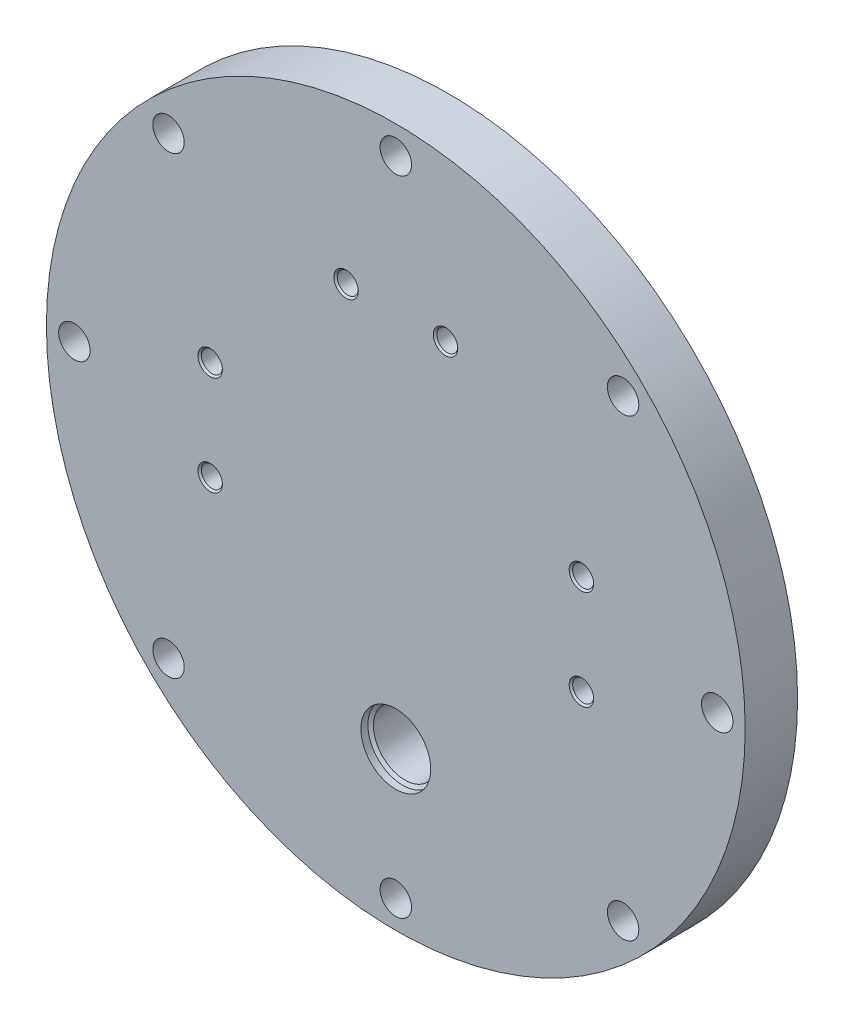
ISO-10303-21;
HEADER;
FILE_DESCRIPTION(('STEP AP214'),'2;1');
FILE_NAME('part.step','',(''),(''),'','','');
FILE_SCHEMA(('AUTOMOTIVE_DESIGN { 1 0 10303 214 1 1 1 1 }'));
ENDSEC;
DATA;
#1=APPLICATION_CONTEXT('core data for automotive mechanical design processes');
#2=APPLICATION_PROTOCOL_DEFINITION('international standard','automotive_design',2000,#1);
#3=PRODUCT_CONTEXT('',#1,'mechanical');
#4=PRODUCT('Part','Part','',(#3));
#5=PRODUCT_RELATED_PRODUCT_CATEGORY('part','',(#4));
#6=PRODUCT_DEFINITION_FORMATION('','',#4);
#7=PRODUCT_DEFINITION_CONTEXT('part definition',#1,'design');
#8=PRODUCT_DEFINITION('design','',#6,#7);
#9=PRODUCT_DEFINITION_SHAPE('','',#8);
#10=(LENGTH_UNIT() NAMED_UNIT(*) SI_UNIT(.MILLI.,.METRE.));
#11=(NAMED_UNIT(*) PLANE_ANGLE_UNIT() SI_UNIT($,.RADIAN.));
#12=(NAMED_UNIT(*) SI_UNIT($,.STERADIAN.) SOLID_ANGLE_UNIT());
#13=UNCERTAINTY_MEASURE_WITH_UNIT(LENGTH_MEASURE(1.E-05),#10,'distance_accuracy_value','');
#14=(GEOMETRIC_REPRESENTATION_CONTEXT(3) GLOBAL_UNCERTAINTY_ASSIGNED_CONTEXT((#13)) GLOBAL_UNIT_ASSIGNED_CONTEXT((#10,
#11,#12)) REPRESENTATION_CONTEXT('',''));
#15=CARTESIAN_POINT('',(0.,0.,0.));
#16=DIRECTION('',(0.,0.,1.));
#17=DIRECTION('',(1.,0.,0.));
#18=AXIS2_PLACEMENT_3D('',#15,#16,#17);
#19=CARTESIAN_POINT('',(38.8908729652601,38.8908729652601,5.00000000010914));
#20=DIRECTION('',(0.,0.,-1.));
#21=DIRECTION('',(-1.,0.,0.));
#22=AXIS2_PLACEMENT_3D('',#19,#20,#21);
#23=CONICAL_SURFACE('',#22,3.32349999981692,1.02974425858134);
#24=CARTESIAN_POINT('',(38.8908729652601,38.8908729650552,6.99696026742913));
#25=VERTEX_POINT('',#24);
#26=VERTEX_LOOP('',#25);
#27=FACE_BOUND('',#26,.T.);
#28=CARTESIAN_POINT('',(38.8908729652601,38.8908729652601,5.));
#29=DIRECTION('',(0.,0.,-1.));
#30=DIRECTION('',(-1.,0.,0.));
#31=AXIS2_PLACEMENT_3D('',#28,#29,#30);
#32=CIRCLE('',#31,3.3235);
#33=CARTESIAN_POINT('',(35.5673729652601,38.8908729652601,5.));
#34=VERTEX_POINT('',#33);
#35=EDGE_CURVE('E43',#34,#34,#32,.T.);
#36=ORIENTED_EDGE('',*,*,#35,.T.);
#37=EDGE_LOOP('',(#36));
#38=FACE_BOUND('',#37,.T.);
#39=ADVANCED_FACE('F16',(#27,#38),#23,.F.);
#40=CARTESIAN_POINT('',(38.8908729652601,-38.8908729652601,5.00000000010914));
#41=DIRECTION('',(0.,0.,-1.));
#42=DIRECTION('',(-1.,0.,0.));
#43=AXIS2_PLACEMENT_3D('',#40,#41,#42);
#44=CONICAL_SURFACE('',#43,3.32349999981692,1.02974425858134);
#45=CARTESIAN_POINT('',(38.8908729650552,-38.8908729652601,6.99696026742913));
#46=VERTEX_POINT('',#45);
#47=VERTEX_LOOP('',#46);
#48=FACE_BOUND('',#47,.T.);
#49=CARTESIAN_POINT('',(38.8908729652601,-38.8908729652601,5.));
#50=DIRECTION('',(0.,0.,-1.));
#51=DIRECTION('',(-1.,0.,0.));
#52=AXIS2_PLACEMENT_3D('',#49,#50,#51);
#53=CIRCLE('',#52,3.3235);
#54=CARTESIAN_POINT('',(35.5673729652601,-38.8908729652601,5.));
#55=VERTEX_POINT('',#54);
#56=EDGE_CURVE('E45',#55,#55,#53,.T.);
#57=ORIENTED_EDGE('',*,*,#56,.T.);
#58=EDGE_LOOP('',(#57));
#59=FACE_BOUND('',#58,.T.);
#60=ADVANCED_FACE('F40',(#48,#59),#44,.F.);
#61=CARTESIAN_POINT('',(-38.8908729652601,-38.8908729652601,5.00000000010914));
#62=DIRECTION('',(0.,0.,-1.));
#63=DIRECTION('',(-1.,0.,0.));
#64=AXIS2_PLACEMENT_3D('',#61,#62,#63);
#65=CONICAL_SURFACE('',#64,3.32349999981692,1.02974425858134);
#66=CARTESIAN_POINT('',(-38.8908729652601,-38.8908729650552,6.99696026742913));
#67=VERTEX_POINT('',#66);
#68=VERTEX_LOOP('',#67);
#69=FACE_BOUND('',#68,.T.);
#70=CARTESIAN_POINT('',(-38.8908729652601,-38.8908729652601,5.));
#71=DIRECTION('',(0.,0.,-1.));
#72=DIRECTION('',(-1.,0.,0.));
#73=AXIS2_PLACEMENT_3D('',#70,#71,#72);
#74=CIRCLE('',#73,3.3235);
#75=CARTESIAN_POINT('',(-42.2143729652601,-38.8908729652601,5.));
#76=VERTEX_POINT('',#75);
#77=EDGE_CURVE('E48',#76,#76,#74,.T.);
#78=ORIENTED_EDGE('',*,*,#77,.T.);
#79=EDGE_LOOP('',(#78));
#80=FACE_BOUND('',#79,.T.);
#81=ADVANCED_FACE('F214',(#69,#80),#65,.F.);
#82=CARTESIAN_POINT('',(-38.8908729652601,38.8908729652601,5.00000000010914));
#83=DIRECTION('',(0.,0.,-1.));
#84=DIRECTION('',(-1.,0.,0.));
#85=AXIS2_PLACEMENT_3D('',#82,#83,#84);
#86=CONICAL_SURFACE('',#85,3.32349999981692,1.02974425858134);
#87=CARTESIAN_POINT('',(-38.8908729650552,38.8908729652601,6.99696026742913));
#88=VERTEX_POINT('',#87);
#89=VERTEX_LOOP('',#88);
#90=FACE_BOUND('',#89,.T.);
#91=CARTESIAN_POINT('',(-38.8908729652601,38.8908729652601,5.));
#92=DIRECTION('',(0.,0.,-1.));
#93=DIRECTION('',(-1.,0.,0.));
#94=AXIS2_PLACEMENT_3D('',#91,#92,#93);
#95=CIRCLE('',#94,3.3235);
#96=CARTESIAN_POINT('',(-42.2143729652601,38.8908729652601,5.));
#97=VERTEX_POINT('',#96);
#98=EDGE_CURVE('E202',#97,#97,#95,.T.);
#99=ORIENTED_EDGE('',*,*,#98,.T.);
#100=EDGE_LOOP('',(#99));
#101=FACE_BOUND('',#100,.T.);
#102=ADVANCED_FACE('F398',(#90,#101),#86,.F.);
#103=CARTESIAN_POINT('',(38.8908729652601,38.8908729652601,-5.));
#104=DIRECTION('',(0.,0.,-1.));
#105=DIRECTION('',(-1.,0.,0.));
#106=AXIS2_PLACEMENT_3D('',#103,#104,#105);
#107=CYLINDRICAL_SURFACE('',#106,3.3235);
#108=ORIENTED_EDGE('',*,*,#35,.F.);
#109=EDGE_LOOP('',(#108));
#110=FACE_BOUND('',#109,.T.);
#111=CARTESIAN_POINT('',(38.8908729652601,38.8908729652601,-13.8235000000009));
#112=DIRECTION('',(0.,0.,-1.));
#113=DIRECTION('',(0.,1.,0.));
#114=AXIS2_PLACEMENT_3D('',#111,#112,#113);
#115=CIRCLE('',#114,3.32350000004429);
#116=CARTESIAN_POINT('',(38.8908729652601,42.2143729653044,-13.8235000000009));
#117=VERTEX_POINT('',#116);
#118=EDGE_CURVE('E197',#117,#117,#115,.T.);
#119=ORIENTED_EDGE('',*,*,#118,.T.);
#120=EDGE_LOOP('',(#119));
#121=FACE_BOUND('',#120,.T.);
#122=ADVANCED_FACE('F394',(#110,#121),#107,.F.);
#123=CARTESIAN_POINT('',(38.8908729652601,-38.8908729652601,-5.));
#124=DIRECTION('',(0.,0.,-1.));
#125=DIRECTION('',(-1.,0.,0.));
#126=AXIS2_PLACEMENT_3D('',#123,#124,#125);
#127=CYLINDRICAL_SURFACE('',#126,3.3235);
#128=ORIENTED_EDGE('',*,*,#56,.F.);
#129=EDGE_LOOP('',(#128));
#130=FACE_BOUND('',#129,.T.);
#131=CARTESIAN_POINT('',(38.8908729652601,-38.8908729652601,-13.8235000000009));
#132=DIRECTION('',(0.,0.,-1.));
#133=DIRECTION('',(1.,0.,0.));
#134=AXIS2_PLACEMENT_3D('',#131,#132,#133);
#135=CIRCLE('',#134,3.32350000004429);
#136=CARTESIAN_POINT('',(42.2143729653044,-38.8908729652601,-13.8235000000009));
#137=VERTEX_POINT('',#136);
#138=EDGE_CURVE('E192',#137,#137,#135,.T.);
#139=ORIENTED_EDGE('',*,*,#138,.T.);
#140=EDGE_LOOP('',(#139));
#141=FACE_BOUND('',#140,.T.);
#142=ADVANCED_FACE('F220',(#130,#141),#127,.F.);
#143=CARTESIAN_POINT('',(-38.8908729652601,-38.8908729652601,-5.));
#144=DIRECTION('',(0.,0.,-1.));
#145=DIRECTION('',(-1.,0.,0.));
#146=AXIS2_PLACEMENT_3D('',#143,#144,#145);
#147=CYLINDRICAL_SURFACE('',#146,3.3235);
#148=ORIENTED_EDGE('',*,*,#77,.F.);
#149=EDGE_LOOP('',(#148));
#150=FACE_BOUND('',#149,.T.);
#151=CARTESIAN_POINT('',(-38.8908729652601,-38.8908729652601,-13.8235000000009));
#152=DIRECTION('',(0.,0.,-1.));
#153=DIRECTION('',(0.,-1.,0.));
#154=AXIS2_PLACEMENT_3D('',#151,#152,#153);
#155=CIRCLE('',#154,3.32350000004429);
#156=CARTESIAN_POINT('',(-38.8908729652601,-42.2143729653044,-13.8235000000009));
#157=VERTEX_POINT('',#156);
#158=EDGE_CURVE('E187',#157,#157,#155,.T.);
#159=ORIENTED_EDGE('',*,*,#158,.T.);
#160=EDGE_LOOP('',(#159));
#161=FACE_BOUND('',#160,.T.);
#162=ADVANCED_FACE('F216',(#150,#161),#147,.F.);
#163=CARTESIAN_POINT('',(-38.8908729652601,38.8908729652601,-5.));
#164=DIRECTION('',(0.,0.,-1.));
#165=DIRECTION('',(-1.,0.,0.));
#166=AXIS2_PLACEMENT_3D('',#163,#164,#165);
#167=CYLINDRICAL_SURFACE('',#166,3.3235);
#168=ORIENTED_EDGE('',*,*,#98,.F.);
#169=EDGE_LOOP('',(#168));
#170=FACE_BOUND('',#169,.T.);
#171=CARTESIAN_POINT('',(-38.8908729652601,38.8908729652601,-13.8235000000009));
#172=DIRECTION('',(0.,0.,-1.));
#173=DIRECTION('',(-1.,0.,0.));
#174=AXIS2_PLACEMENT_3D('',#171,#172,#173);
#175=CIRCLE('',#174,3.32350000004429);
#176=CARTESIAN_POINT('',(-42.2143729653044,38.8908729652601,-13.8235000000009));
#177=VERTEX_POINT('',#176);
#178=EDGE_CURVE('E175',#177,#177,#175,.T.);
#179=ORIENTED_EDGE('',*,*,#178,.T.);
#180=EDGE_LOOP('',(#179));
#181=FACE_BOUND('',#180,.T.);
#182=ADVANCED_FACE('F219',(#170,#181),#167,.F.);
#183=CARTESIAN_POINT('',(0.,-55.,-5.6843418860808E-11));
#184=DIRECTION('',(0.,0.,1.));
#185=DIRECTION('',(1.,0.,0.));
#186=AXIS2_PLACEMENT_3D('',#183,#184,#185);
#187=CONICAL_SURFACE('',#186,8.99999999984402,1.0297442586752);
#188=CARTESIAN_POINT('',(0.,-55.,0.));
#189=DIRECTION('',(0.,0.,1.));
#190=DIRECTION('',(1.,0.,0.));
#191=AXIS2_PLACEMENT_3D('',#188,#189,#190);
#192=CIRCLE('',#191,9.);
#193=CARTESIAN_POINT('',(9.,-55.,0.));
#194=VERTEX_POINT('',#193);
#195=EDGE_CURVE('E166',#194,#194,#192,.T.);
#196=ORIENTED_EDGE('',*,*,#195,.T.);
#197=EDGE_LOOP('',(#196));
#198=FACE_BOUND('',#197,.T.);
#199=CARTESIAN_POINT('',(0.,-55.,-1.5021515475689));
#200=DIRECTION('',(0.,0.,-1.));
#201=DIRECTION('',(-1.,0.,0.));
#202=AXIS2_PLACEMENT_3D('',#199,#200,#201);
#203=CIRCLE('',#202,6.5);
#204=CARTESIAN_POINT('',(-6.5,-55.,-1.5021515475689));
#205=VERTEX_POINT('',#204);
#206=EDGE_CURVE('E170',#205,#205,#203,.T.);
#207=ORIENTED_EDGE('',*,*,#206,.T.);
#208=EDGE_LOOP('',(#207));
#209=FACE_BOUND('',#208,.T.);
#210=ADVANCED_FACE('F385',(#198,#209),#187,.F.);
#211=CARTESIAN_POINT('',(38.8908729652601,38.8908729652601,-15.0000000000432));
#212=DIRECTION('',(0.,0.,-1.));
#213=DIRECTION('',(-1.,0.,0.));
#214=AXIS2_PLACEMENT_3D('',#211,#212,#213);
#215=CONICAL_SURFACE('',#214,4.50000000008662,0.785398163397448);
#216=ORIENTED_EDGE('',*,*,#118,.F.);
#217=EDGE_LOOP('',(#216));
#218=FACE_BOUND('',#217,.T.);
#219=CARTESIAN_POINT('',(38.8908729652601,38.8908729652601,-14.9999999999864));
#220=DIRECTION('',(0.,0.,-1.));
#221=DIRECTION('',(-1.,0.,0.));
#222=AXIS2_PLACEMENT_3D('',#219,#220,#221);
#223=CIRCLE('',#222,4.50000000002977);
#224=CARTESIAN_POINT('',(34.3908729652303,38.8908729652601,-14.9999999999864));
#225=VERTEX_POINT('',#224);
#226=EDGE_CURVE('E19',#225,#225,#223,.T.);
#227=ORIENTED_EDGE('',*,*,#226,.T.);
#228=EDGE_LOOP('',(#227));
#229=FACE_BOUND('',#228,.T.);
#230=ADVANCED_FACE('F381',(#218,#229),#215,.F.);
#231=CARTESIAN_POINT('',(38.8908729652601,-38.8908729652601,-15.0000000000432));
#232=DIRECTION('',(0.,0.,-1.));
#233=DIRECTION('',(-1.,0.,0.));
#234=AXIS2_PLACEMENT_3D('',#231,#232,#233);
#235=CONICAL_SURFACE('',#234,4.50000000008662,0.785398163397448);
#236=ORIENTED_EDGE('',*,*,#138,.F.);
#237=EDGE_LOOP('',(#236));
#238=FACE_BOUND('',#237,.T.);
#239=CARTESIAN_POINT('',(38.8908729652601,-38.8908729652601,-14.9999999999864));
#240=DIRECTION('',(0.,0.,-1.));
#241=DIRECTION('',(-1.,0.,0.));
#242=AXIS2_PLACEMENT_3D('',#239,#240,#241);
#243=CIRCLE('',#242,4.50000000002977);
#244=CARTESIAN_POINT('',(34.3908729652303,-38.8908729652601,-14.9999999999864));
#245=VERTEX_POINT('',#244);
#246=EDGE_CURVE('E161',#245,#245,#243,.T.);
#247=ORIENTED_EDGE('',*,*,#246,.T.);
#248=EDGE_LOOP('',(#247));
#249=FACE_BOUND('',#248,.T.);
#250=ADVANCED_FACE('F228',(#238,#249),#235,.F.);
#251=CARTESIAN_POINT('',(-38.8908729652601,-38.8908729652601,-15.0000000000432));
#252=DIRECTION('',(0.,0.,-1.));
#253=DIRECTION('',(-1.,0.,0.));
#254=AXIS2_PLACEMENT_3D('',#251,#252,#253);
#255=CONICAL_SURFACE('',#254,4.50000000008662,0.785398163397448);
#256=ORIENTED_EDGE('',*,*,#158,.F.);
#257=EDGE_LOOP('',(#256));
#258=FACE_BOUND('',#257,.T.);
#259=CARTESIAN_POINT('',(-38.8908729652601,-38.8908729652601,-14.9999999999864));
#260=DIRECTION('',(0.,0.,-1.));
#261=DIRECTION('',(-1.,0.,0.));
#262=AXIS2_PLACEMENT_3D('',#259,#260,#261);
#263=CIRCLE('',#262,4.50000000002977);
#264=CARTESIAN_POINT('',(-43.3908729652899,-38.8908729652601,-14.9999999999864));
#265=VERTEX_POINT('',#264);
#266=EDGE_CURVE('E159',#265,#265,#263,.T.);
#267=ORIENTED_EDGE('',*,*,#266,.T.);
#268=EDGE_LOOP('',(#267));
#269=FACE_BOUND('',#268,.T.);
#270=ADVANCED_FACE('F224',(#258,#269),#255,.F.);
#271=CARTESIAN_POINT('',(-38.8908729652601,38.8908729652601,-15.0000000000432));
#272=DIRECTION('',(0.,0.,-1.));
#273=DIRECTION('',(-1.,0.,0.));
#274=AXIS2_PLACEMENT_3D('',#271,#272,#273);
#275=CONICAL_SURFACE('',#274,4.50000000008662,0.785398163397448);
#276=ORIENTED_EDGE('',*,*,#178,.F.);
#277=EDGE_LOOP('',(#276));
#278=FACE_BOUND('',#277,.T.);
#279=CARTESIAN_POINT('',(-38.8908729652601,38.8908729652601,-14.9999999999864));
#280=DIRECTION('',(0.,0.,-1.));
#281=DIRECTION('',(-1.,0.,0.));
#282=AXIS2_PLACEMENT_3D('',#279,#280,#281);
#283=CIRCLE('',#282,4.50000000002977);
#284=CARTESIAN_POINT('',(-43.3908729652899,38.8908729652601,-14.9999999999864));
#285=VERTEX_POINT('',#284);
#286=EDGE_CURVE('E156',#285,#285,#283,.T.);
#287=ORIENTED_EDGE('',*,*,#286,.T.);
#288=EDGE_LOOP('',(#287));
#289=FACE_BOUND('',#288,.T.);
#290=ADVANCED_FACE('F227',(#278,#289),#275,.F.);
#291=CARTESIAN_POINT('',(0.,-55.,15.));
#292=DIRECTION('',(0.,0.,-1.));
#293=DIRECTION('',(-1.,0.,0.));
#294=AXIS2_PLACEMENT_3D('',#291,#292,#293);
#295=CYLINDRICAL_SURFACE('',#294,6.5);
#296=CARTESIAN_POINT('',(0.,-55.,-15.));
#297=DIRECTION('',(0.,0.,-1.));
#298=DIRECTION('',(-1.,0.,0.));
#299=AXIS2_PLACEMENT_3D('',#296,#297,#298);
#300=CIRCLE('',#299,6.5);
#301=CARTESIAN_POINT('',(-6.5,-55.,-15.));
#302=VERTEX_POINT('',#301);
#303=EDGE_CURVE('E153',#302,#302,#300,.T.);
#304=ORIENTED_EDGE('',*,*,#303,.T.);
#305=EDGE_LOOP('',(#304));
#306=FACE_BOUND('',#305,.T.);
#307=ORIENTED_EDGE('',*,*,#206,.F.);
#308=EDGE_LOOP('',(#307));
#309=FACE_BOUND('',#308,.T.);
#310=ADVANCED_FACE('F368',(#306,#309),#295,.F.);
#311=CARTESIAN_POINT('',(0.,-55.,7.5));
#312=DIRECTION('',(0.,0.,1.));
#313=DIRECTION('',(1.,0.,0.));
#314=AXIS2_PLACEMENT_3D('',#311,#312,#313);
#315=CYLINDRICAL_SURFACE('',#314,9.);
#316=ORIENTED_EDGE('',*,*,#195,.F.);
#317=EDGE_LOOP('',(#316));
#318=FACE_BOUND('',#317,.T.);
#319=CARTESIAN_POINT('',(0.,-55.,12.3991393809888));
#320=DIRECTION('',(0.,0.,1.));
#321=DIRECTION('',(1.,0.,0.));
#322=AXIS2_PLACEMENT_3D('',#319,#320,#321);
#323=CIRCLE('',#322,8.99999999995771);
#324=CARTESIAN_POINT('',(8.99999999995771,-55.,12.3991393809888));
#325=VERTEX_POINT('',#324);
#326=EDGE_CURVE('E149',#325,#325,#323,.T.);
#327=ORIENTED_EDGE('',*,*,#326,.T.);
#328=EDGE_LOOP('',(#327));
#329=FACE_BOUND('',#328,.T.);
#330=ADVANCED_FACE('F236',(#318,#329),#315,.F.);
#331=CARTESIAN_POINT('',(0.,0.,-15.));
#332=DIRECTION('',(0.,0.,1.));
#333=DIRECTION('',(1.,0.,0.));
#334=AXIS2_PLACEMENT_3D('',#331,#332,#333);
#335=PLANE('',#334);
#336=CARTESIAN_POINT('',(53.1259204458988,-14.2350474806386,-15.));
#337=DIRECTION('',(0.,0.,1.));
#338=DIRECTION('',(1.,0.,0.));
#339=AXIS2_PLACEMENT_3D('',#336,#337,#338);
#340=CIRCLE('',#339,3.);
#341=CARTESIAN_POINT('',(56.1259204458988,-14.2350474806386,-15.));
#342=VERTEX_POINT('',#341);
#343=EDGE_CURVE('E131',#342,#342,#340,.T.);
#344=ORIENTED_EDGE('',*,*,#343,.T.);
#345=EDGE_LOOP('',(#344));
#346=FACE_BOUND('',#345,.T.);
#347=CARTESIAN_POINT('',(53.1259204458988,14.2350474806387,-15.));
#348=DIRECTION('',(0.,0.,1.));
#349=DIRECTION('',(1.,0.,0.));
#350=AXIS2_PLACEMENT_3D('',#347,#348,#349);
#351=CIRCLE('',#350,3.);
#352=CARTESIAN_POINT('',(56.1259204458988,14.2350474806387,-15.));
#353=VERTEX_POINT('',#352);
#354=EDGE_CURVE('E134',#353,#353,#351,.T.);
#355=ORIENTED_EDGE('',*,*,#354,.T.);
#356=EDGE_LOOP('',(#355));
#357=FACE_BOUND('',#356,.T.);
#358=CARTESIAN_POINT('',(14.2350474806386,53.1259204458988,-15.));
#359=DIRECTION('',(0.,0.,1.));
#360=DIRECTION('',(1.,0.,0.));
#361=AXIS2_PLACEMENT_3D('',#358,#359,#360);
#362=CIRCLE('',#361,3.);
#363=CARTESIAN_POINT('',(17.2350474806386,53.1259204458988,-15.));
#364=VERTEX_POINT('',#363);
#365=EDGE_CURVE('E137',#364,#364,#362,.T.);
#366=ORIENTED_EDGE('',*,*,#365,.T.);
#367=EDGE_LOOP('',(#366));
#368=FACE_BOUND('',#367,.T.);
#369=CARTESIAN_POINT('',(-53.1259204458988,14.2350474806386,-15.));
#370=DIRECTION('',(0.,0.,1.));
#371=DIRECTION('',(1.,0.,0.));
#372=AXIS2_PLACEMENT_3D('',#369,#370,#371);
#373=CIRCLE('',#372,3.);
#374=CARTESIAN_POINT('',(-50.1259204458988,14.2350474806386,-15.));
#375=VERTEX_POINT('',#374);
#376=EDGE_CURVE('E140',#375,#375,#373,.T.);
#377=ORIENTED_EDGE('',*,*,#376,.T.);
#378=EDGE_LOOP('',(#377));
#379=FACE_BOUND('',#378,.T.);
#380=CARTESIAN_POINT('',(-14.2350474806386,53.1259204458988,-15.));
#381=DIRECTION('',(0.,0.,1.));
#382=DIRECTION('',(1.,0.,0.));
#383=AXIS2_PLACEMENT_3D('',#380,#381,#382);
#384=CIRCLE('',#383,3.);
#385=CARTESIAN_POINT('',(-11.2350474806386,53.1259204458988,-15.));
#386=VERTEX_POINT('',#385);
#387=EDGE_CURVE('E143',#386,#386,#384,.T.);
#388=ORIENTED_EDGE('',*,*,#387,.T.);
#389=EDGE_LOOP('',(#388));
#390=FACE_BOUND('',#389,.T.);
#391=CARTESIAN_POINT('',(-53.1259204458988,-14.2350474806386,-15.));
#392=DIRECTION('',(0.,0.,1.));
#393=DIRECTION('',(1.,0.,0.));
#394=AXIS2_PLACEMENT_3D('',#391,#392,#393);
#395=CIRCLE('',#394,3.);
#396=CARTESIAN_POINT('',(-50.1259204458988,-14.2350474806386,-15.));
#397=VERTEX_POINT('',#396);
#398=EDGE_CURVE('E146',#397,#397,#395,.T.);
#399=ORIENTED_EDGE('',*,*,#398,.T.);
#400=EDGE_LOOP('',(#399));
#401=FACE_BOUND('',#400,.T.);
#402=ORIENTED_EDGE('',*,*,#303,.F.);
#403=EDGE_LOOP('',(#402));
#404=FACE_BOUND('',#403,.T.);
#405=ORIENTED_EDGE('',*,*,#286,.F.);
#406=EDGE_LOOP('',(#405));
#407=FACE_BOUND('',#406,.T.);
#408=ORIENTED_EDGE('',*,*,#266,.F.);
#409=EDGE_LOOP('',(#408));
#410=FACE_BOUND('',#409,.T.);
#411=ORIENTED_EDGE('',*,*,#246,.F.);
#412=EDGE_LOOP('',(#411));
#413=FACE_BOUND('',#412,.T.);
#414=ORIENTED_EDGE('',*,*,#226,.F.);
#415=EDGE_LOOP('',(#414));
#416=FACE_BOUND('',#415,.T.);
#417=CARTESIAN_POINT('',(0.,0.,-15.));
#418=DIRECTION('',(0.,0.,-1.));
#419=DIRECTION('',(-1.,0.,0.));
#420=AXIS2_PLACEMENT_3D('',#417,#418,#419);
#421=CIRCLE('',#420,67.);
#422=CARTESIAN_POINT('',(-67.,0.,-15.));
#423=VERTEX_POINT('',#422);
#424=EDGE_CURVE('E150',#423,#423,#421,.F.);
#425=ORIENTED_EDGE('',*,*,#424,.F.);
#426=EDGE_LOOP('',(#425));
#427=FACE_BOUND('',#426,.T.);
#428=ADVANCED_FACE('F232',(#346,#357,#368,#379,#390,#401,#404,#407,#410,#413,#416,#427),#335,.F.);
#429=CARTESIAN_POINT('',(0.,0.,0.));
#430=DIRECTION('',(0.,0.,-1.));
#431=DIRECTION('',(-1.,0.,0.));
#432=AXIS2_PLACEMENT_3D('',#429,#430,#431);
#433=CYLINDRICAL_SURFACE('',#432,67.);
#434=CARTESIAN_POINT('',(0.,0.,0.));
#435=DIRECTION('',(0.,0.,-1.));
#436=DIRECTION('',(-1.,0.,0.));
#437=AXIS2_PLACEMENT_3D('',#434,#435,#436);
#438=CIRCLE('',#437,67.);
#439=CARTESIAN_POINT('',(-67.,0.,0.));
#440=VERTEX_POINT('',#439);
#441=EDGE_CURVE('E128',#440,#440,#438,.F.);
#442=ORIENTED_EDGE('',*,*,#441,.F.);
#443=EDGE_LOOP('',(#442));
#444=FACE_BOUND('',#443,.T.);
#445=ORIENTED_EDGE('',*,*,#424,.T.);
#446=EDGE_LOOP('',(#445));
#447=FACE_BOUND('',#446,.T.);
#448=ADVANCED_FACE('F235',(#444,#447),#433,.T.);
#449=CARTESIAN_POINT('',(0.,-55.,12.99999999992));
#450=DIRECTION('',(0.,0.,1.));
#451=DIRECTION('',(1.,0.,0.));
#452=AXIS2_PLACEMENT_3D('',#449,#450,#451);
#453=CONICAL_SURFACE('',#452,9.99999999976353,1.02974425867018);
#454=CARTESIAN_POINT('',(0.,-55.,13.));
#455=DIRECTION('',(0.,0.,1.));
#456=DIRECTION('',(1.,0.,0.));
#457=AXIS2_PLACEMENT_3D('',#454,#455,#456);
#458=CIRCLE('',#457,10.);
#459=CARTESIAN_POINT('',(10.,-55.,13.));
#460=VERTEX_POINT('',#459);
#461=EDGE_CURVE('E127',#460,#460,#458,.T.);
#462=ORIENTED_EDGE('',*,*,#461,.T.);
#463=EDGE_LOOP('',(#462));
#464=FACE_BOUND('',#463,.T.);
#465=ORIENTED_EDGE('',*,*,#326,.F.);
#466=EDGE_LOOP('',(#465));
#467=FACE_BOUND('',#466,.T.);
#468=ADVANCED_FACE('F244',(#464,#467),#453,.F.);
#469=CARTESIAN_POINT('',(-53.1259204458988,-14.2350474806386,-269.429253066558));
#470=DIRECTION('',(0.,0.,1.));
#471=DIRECTION('',(1.,0.,0.));
#472=AXIS2_PLACEMENT_3D('',#469,#470,#471);
#473=CYLINDRICAL_SURFACE('',#472,3.);
#474=CARTESIAN_POINT('',(-53.1259204458988,-14.2350474806386,14.4999999999982));
#475=DIRECTION('',(0.,0.,1.));
#476=DIRECTION('',(-0.866025403782241,-0.500000000003806,0.));
#477=AXIS2_PLACEMENT_3D('',#474,#475,#476);
#478=CIRCLE('',#477,3.0000000000211);
#479=CARTESIAN_POINT('',(-55.7239966572638,-15.7350474806606,14.4999999999982));
#480=VERTEX_POINT('',#479);
#481=EDGE_CURVE('E359',#480,#480,#478,.T.);
#482=ORIENTED_EDGE('',*,*,#481,.T.);
#483=EDGE_LOOP('',(#482));
#484=FACE_BOUND('',#483,.T.);
#485=ORIENTED_EDGE('',*,*,#398,.F.);
#486=EDGE_LOOP('',(#485));
#487=FACE_BOUND('',#486,.T.);
#488=ADVANCED_FACE('F251',(#484,#487),#473,.F.);
#489=CARTESIAN_POINT('',(-14.2350474806386,53.1259204458988,-269.429253066558));
#490=DIRECTION('',(0.,0.,1.));
#491=DIRECTION('',(1.,0.,0.));
#492=AXIS2_PLACEMENT_3D('',#489,#490,#491);
#493=CYLINDRICAL_SURFACE('',#492,3.);
#494=CARTESIAN_POINT('',(-14.2350474806386,53.1259204458988,14.4999999999982));
#495=DIRECTION('',(0.,0.,1.));
#496=DIRECTION('',(-0.500000000003806,0.866025403782241,0.));
#497=AXIS2_PLACEMENT_3D('',#494,#495,#496);
#498=CIRCLE('',#497,3.0000000000211);
#499=CARTESIAN_POINT('',(-15.7350474806606,55.7239966572638,14.4999999999982));
#500=VERTEX_POINT('',#499);
#501=EDGE_CURVE('E649',#500,#500,#498,.T.);
#502=ORIENTED_EDGE('',*,*,#501,.T.);
#503=EDGE_LOOP('',(#502));
#504=FACE_BOUND('',#503,.T.);
#505=ORIENTED_EDGE('',*,*,#387,.F.);
#506=EDGE_LOOP('',(#505));
#507=FACE_BOUND('',#506,.T.);
#508=ADVANCED_FACE('F347',(#504,#507),#493,.F.);
#509=CARTESIAN_POINT('',(-53.1259204458988,14.2350474806386,-269.429253066558));
#510=DIRECTION('',(0.,0.,1.));
#511=DIRECTION('',(1.,0.,0.));
#512=AXIS2_PLACEMENT_3D('',#509,#510,#511);
#513=CYLINDRICAL_SURFACE('',#512,3.);
#514=CARTESIAN_POINT('',(-53.1259204458988,14.2350474806386,14.4999999999982));
#515=DIRECTION('',(0.,0.,1.));
#516=DIRECTION('',(-1.,0.,0.));
#517=AXIS2_PLACEMENT_3D('',#514,#515,#516);
#518=CIRCLE('',#517,2.99999999998048);
#519=CARTESIAN_POINT('',(-56.1259204458793,14.2350474806386,14.4999999999982));
#520=VERTEX_POINT('',#519);
#521=EDGE_CURVE('E654',#520,#520,#518,.T.);
#522=ORIENTED_EDGE('',*,*,#521,.T.);
#523=EDGE_LOOP('',(#522));
#524=FACE_BOUND('',#523,.T.);
#525=ORIENTED_EDGE('',*,*,#376,.F.);
#526=EDGE_LOOP('',(#525));
#527=FACE_BOUND('',#526,.T.);
#528=ADVANCED_FACE('F343',(#524,#527),#513,.F.);
#529=CARTESIAN_POINT('',(14.2350474806386,53.1259204458988,-269.429253066558));
#530=DIRECTION('',(0.,0.,1.));
#531=DIRECTION('',(1.,0.,0.));
#532=AXIS2_PLACEMENT_3D('',#529,#530,#531);
#533=CYLINDRICAL_SURFACE('',#532,3.);
#534=CARTESIAN_POINT('',(14.2350474806386,53.1259204458988,14.4999999999982));
#535=DIRECTION('',(0.,0.,1.));
#536=DIRECTION('',(0.,1.,0.));
#537=AXIS2_PLACEMENT_3D('',#534,#535,#536);
#538=CIRCLE('',#537,2.99999999998048);
#539=CARTESIAN_POINT('',(14.2350474806386,56.1259204458793,14.4999999999982));
#540=VERTEX_POINT('',#539);
#541=EDGE_CURVE('E659',#540,#540,#538,.T.);
#542=ORIENTED_EDGE('',*,*,#541,.T.);
#543=EDGE_LOOP('',(#542));
#544=FACE_BOUND('',#543,.T.);
#545=ORIENTED_EDGE('',*,*,#365,.F.);
#546=EDGE_LOOP('',(#545));
#547=FACE_BOUND('',#546,.T.);
#548=ADVANCED_FACE('F339',(#544,#547),#533,.F.);
#549=CARTESIAN_POINT('',(53.1259204458988,14.2350474806387,-269.429253066558));
#550=DIRECTION('',(0.,0.,1.));
#551=DIRECTION('',(1.,0.,0.));
#552=AXIS2_PLACEMENT_3D('',#549,#550,#551);
#553=CYLINDRICAL_SURFACE('',#552,3.);
#554=CARTESIAN_POINT('',(53.1259204458988,14.2350474806387,14.4999999999982));
#555=DIRECTION('',(0.,0.,1.));
#556=DIRECTION('',(0.866025403781621,0.50000000000488,0.));
#557=AXIS2_PLACEMENT_3D('',#554,#555,#556);
#558=CIRCLE('',#557,2.99999999995761);
#559=CARTESIAN_POINT('',(55.723996657207,15.7350474806321,14.4999999999982));
#560=VERTEX_POINT('',#559);
#561=EDGE_CURVE('E664',#560,#560,#558,.T.);
#562=ORIENTED_EDGE('',*,*,#561,.T.);
#563=EDGE_LOOP('',(#562));
#564=FACE_BOUND('',#563,.T.);
#565=ORIENTED_EDGE('',*,*,#354,.F.);
#566=EDGE_LOOP('',(#565));
#567=FACE_BOUND('',#566,.T.);
#568=ADVANCED_FACE('F335',(#564,#567),#553,.F.);
#569=CARTESIAN_POINT('',(53.1259204458988,-14.2350474806386,-269.429253066558));
#570=DIRECTION('',(0.,0.,1.));
#571=DIRECTION('',(1.,0.,0.));
#572=AXIS2_PLACEMENT_3D('',#569,#570,#571);
#573=CYLINDRICAL_SURFACE('',#572,3.);
#574=CARTESIAN_POINT('',(53.1259204458988,-14.2350474806386,14.4999999999982));
#575=DIRECTION('',(0.,0.,1.));
#576=DIRECTION('',(1.,0.,0.));
#577=AXIS2_PLACEMENT_3D('',#574,#575,#576);
#578=CIRCLE('',#577,2.99999999998048);
#579=CARTESIAN_POINT('',(56.1259204458793,-14.2350474806386,14.4999999999982));
#580=VERTEX_POINT('',#579);
#581=EDGE_CURVE('E123',#580,#580,#578,.T.);
#582=ORIENTED_EDGE('',*,*,#581,.T.);
#583=EDGE_LOOP('',(#582));
#584=FACE_BOUND('',#583,.T.);
#585=ORIENTED_EDGE('',*,*,#343,.F.);
#586=EDGE_LOOP('',(#585));
#587=FACE_BOUND('',#586,.T.);
#588=ADVANCED_FACE('F331',(#584,#587),#573,.F.);
#589=CARTESIAN_POINT('',(0.,0.,0.));
#590=DIRECTION('',(0.,0.,-1.));
#591=DIRECTION('',(-1.,0.,0.));
#592=AXIS2_PLACEMENT_3D('',#589,#590,#591);
#593=PLANE('',#592);
#594=CARTESIAN_POINT('',(92.,0.,0.));
#595=DIRECTION('',(0.,0.,1.));
#596=DIRECTION('',(1.,0.,0.));
#597=AXIS2_PLACEMENT_3D('',#594,#595,#596);
#598=CIRCLE('',#597,4.5);
#599=CARTESIAN_POINT('',(96.5,0.,0.));
#600=VERTEX_POINT('',#599);
#601=EDGE_CURVE('E99',#600,#600,#598,.T.);
#602=ORIENTED_EDGE('',*,*,#601,.T.);
#603=EDGE_LOOP('',(#602));
#604=FACE_BOUND('',#603,.T.);
#605=ORIENTED_EDGE('',*,*,#441,.T.);
#606=EDGE_LOOP('',(#605));
#607=FACE_BOUND('',#606,.T.);
#608=CARTESIAN_POINT('',(65.0538238691624,-65.0538238691624,0.));
#609=DIRECTION('',(0.,0.,1.));
#610=DIRECTION('',(1.,0.,0.));
#611=AXIS2_PLACEMENT_3D('',#608,#609,#610);
#612=CIRCLE('',#611,4.5);
#613=CARTESIAN_POINT('',(69.5538238691624,-65.0538238691624,0.));
#614=VERTEX_POINT('',#613);
#615=EDGE_CURVE('E102',#614,#614,#612,.T.);
#616=ORIENTED_EDGE('',*,*,#615,.T.);
#617=EDGE_LOOP('',(#616));
#618=FACE_BOUND('',#617,.T.);
#619=CARTESIAN_POINT('',(65.0538238691624,65.0538238691624,0.));
#620=DIRECTION('',(0.,0.,1.));
#621=DIRECTION('',(1.,0.,0.));
#622=AXIS2_PLACEMENT_3D('',#619,#620,#621);
#623=CIRCLE('',#622,4.5);
#624=CARTESIAN_POINT('',(69.5538238691624,65.0538238691624,0.));
#625=VERTEX_POINT('',#624);
#626=EDGE_CURVE('E105',#625,#625,#623,.T.);
#627=ORIENTED_EDGE('',*,*,#626,.T.);
#628=EDGE_LOOP('',(#627));
#629=FACE_BOUND('',#628,.T.);
#630=CARTESIAN_POINT('',(0.,92.,0.));
#631=DIRECTION('',(0.,0.,1.));
#632=DIRECTION('',(1.,0.,0.));
#633=AXIS2_PLACEMENT_3D('',#630,#631,#632);
#634=CIRCLE('',#633,4.5);
#635=CARTESIAN_POINT('',(4.50000000000002,92.,0.));
#636=VERTEX_POINT('',#635);
#637=EDGE_CURVE('E108',#636,#636,#634,.T.);
#638=ORIENTED_EDGE('',*,*,#637,.T.);
#639=EDGE_LOOP('',(#638));
#640=FACE_BOUND('',#639,.T.);
#641=CARTESIAN_POINT('',(-65.0538238691624,65.0538238691624,0.));
#642=DIRECTION('',(0.,0.,1.));
#643=DIRECTION('',(1.,0.,0.));
#644=AXIS2_PLACEMENT_3D('',#641,#642,#643);
#645=CIRCLE('',#644,4.5);
#646=CARTESIAN_POINT('',(-60.5538238691624,65.0538238691624,0.));
#647=VERTEX_POINT('',#646);
#648=EDGE_CURVE('E111',#647,#647,#645,.T.);
#649=ORIENTED_EDGE('',*,*,#648,.T.);
#650=EDGE_LOOP('',(#649));
#651=FACE_BOUND('',#650,.T.);
#652=CARTESIAN_POINT('',(-92.,0.,0.));
#653=DIRECTION('',(0.,0.,1.));
#654=DIRECTION('',(1.,0.,0.));
#655=AXIS2_PLACEMENT_3D('',#652,#653,#654);
#656=CIRCLE('',#655,4.5);
#657=CARTESIAN_POINT('',(-87.5,0.,0.));
#658=VERTEX_POINT('',#657);
#659=EDGE_CURVE('E114',#658,#658,#656,.T.);
#660=ORIENTED_EDGE('',*,*,#659,.T.);
#661=EDGE_LOOP('',(#660));
#662=FACE_BOUND('',#661,.T.);
#663=CARTESIAN_POINT('',(-65.0538238691624,-65.0538238691624,0.));
#664=DIRECTION('',(0.,0.,1.));
#665=DIRECTION('',(1.,0.,0.));
#666=AXIS2_PLACEMENT_3D('',#663,#664,#665);
#667=CIRCLE('',#666,4.5);
#668=CARTESIAN_POINT('',(-60.5538238691624,-65.0538238691624,0.));
#669=VERTEX_POINT('',#668);
#670=EDGE_CURVE('E117',#669,#669,#667,.T.);
#671=ORIENTED_EDGE('',*,*,#670,.T.);
#672=EDGE_LOOP('',(#671));
#673=FACE_BOUND('',#672,.T.);
#674=CARTESIAN_POINT('',(0.,-92.,0.));
#675=DIRECTION('',(0.,0.,1.));
#676=DIRECTION('',(1.,0.,0.));
#677=AXIS2_PLACEMENT_3D('',#674,#675,#676);
#678=CIRCLE('',#677,4.5);
#679=CARTESIAN_POINT('',(4.49999999999998,-92.,0.));
#680=VERTEX_POINT('',#679);
#681=EDGE_CURVE('E120',#680,#680,#678,.T.);
#682=ORIENTED_EDGE('',*,*,#681,.T.);
#683=EDGE_LOOP('',(#682));
#684=FACE_BOUND('',#683,.T.);
#685=CARTESIAN_POINT('',(0.,0.,0.));
#686=DIRECTION('',(0.,0.,1.));
#687=DIRECTION('',(1.,0.,0.));
#688=AXIS2_PLACEMENT_3D('',#685,#686,#687);
#689=CIRCLE('',#688,100.);
#690=CARTESIAN_POINT('',(100.,0.,0.));
#691=VERTEX_POINT('',#690);
#692=EDGE_CURVE('E124',#691,#691,#689,.T.);
#693=ORIENTED_EDGE('',*,*,#692,.F.);
#694=EDGE_LOOP('',(#693));
#695=FACE_BOUND('',#694,.T.);
#696=ADVANCED_FACE('F327',(#604,#607,#618,#629,#640,#651,#662,#673,#684,#695),#593,.T.);
#697=CARTESIAN_POINT('',(0.,0.,0.));
#698=DIRECTION('',(0.,0.,1.));
#699=DIRECTION('',(1.,0.,0.));
#700=AXIS2_PLACEMENT_3D('',#697,#698,#699);
#701=CYLINDRICAL_SURFACE('',#700,100.);
#702=ORIENTED_EDGE('',*,*,#692,.T.);
#703=EDGE_LOOP('',(#702));
#704=FACE_BOUND('',#703,.T.);
#705=CARTESIAN_POINT('',(0.,0.,15.));
#706=DIRECTION('',(0.,0.,1.));
#707=DIRECTION('',(1.,0.,0.));
#708=AXIS2_PLACEMENT_3D('',#705,#706,#707);
#709=CIRCLE('',#708,100.);
#710=CARTESIAN_POINT('',(100.,0.,15.));
#711=VERTEX_POINT('',#710);
#712=EDGE_CURVE('E96',#711,#711,#709,.F.);
#713=ORIENTED_EDGE('',*,*,#712,.T.);
#714=EDGE_LOOP('',(#713));
#715=FACE_BOUND('',#714,.T.);
#716=ADVANCED_FACE('F323',(#704,#715),#701,.T.);
#717=CARTESIAN_POINT('',(0.,-55.,14.));
#718=DIRECTION('',(0.,0.,1.));
#719=DIRECTION('',(1.,0.,0.));
#720=AXIS2_PLACEMENT_3D('',#717,#718,#719);
#721=CYLINDRICAL_SURFACE('',#720,10.);
#722=ORIENTED_EDGE('',*,*,#461,.F.);
#723=EDGE_LOOP('',(#722));
#724=FACE_BOUND('',#723,.T.);
#725=CARTESIAN_POINT('',(0.,-55.,15.));
#726=DIRECTION('',(0.,0.,1.));
#727=DIRECTION('',(1.,0.,0.));
#728=AXIS2_PLACEMENT_3D('',#725,#726,#727);
#729=CIRCLE('',#728,10.);
#730=CARTESIAN_POINT('',(10.,-55.,15.));
#731=VERTEX_POINT('',#730);
#732=EDGE_CURVE('E93',#731,#731,#729,.T.);
#733=ORIENTED_EDGE('',*,*,#732,.T.);
#734=EDGE_LOOP('',(#733));
#735=FACE_BOUND('',#734,.T.);
#736=ADVANCED_FACE('F319',(#724,#735),#721,.F.);
#737=CARTESIAN_POINT('',(-53.1259204458988,-14.2350474806386,14.9999999999864));
#738=DIRECTION('',(0.,0.,1.));
#739=DIRECTION('',(1.,0.,0.));
#740=AXIS2_PLACEMENT_3D('',#737,#738,#739);
#741=CONICAL_SURFACE('',#740,3.50000000000421,0.785398163392376);
#742=ORIENTED_EDGE('',*,*,#481,.F.);
#743=EDGE_LOOP('',(#742));
#744=FACE_BOUND('',#743,.T.);
#745=CARTESIAN_POINT('',(-53.1259204458988,-14.2350474806386,14.9999999999864));
#746=DIRECTION('',(0.,0.,1.));
#747=DIRECTION('',(1.,0.,0.));
#748=AXIS2_PLACEMENT_3D('',#745,#746,#747);
#749=CIRCLE('',#748,3.50000000000421);
#750=CARTESIAN_POINT('',(-49.6259204458946,-14.2350474806386,14.9999999999864));
#751=VERTEX_POINT('',#750);
#752=EDGE_CURVE('E90',#751,#751,#749,.T.);
#753=ORIENTED_EDGE('',*,*,#752,.T.);
#754=EDGE_LOOP('',(#753));
#755=FACE_BOUND('',#754,.T.);
#756=ADVANCED_FACE('F315',(#744,#755),#741,.F.);
#757=CARTESIAN_POINT('',(-14.2350474806386,53.1259204458988,14.9999999999864));
#758=DIRECTION('',(0.,0.,1.));
#759=DIRECTION('',(1.,0.,0.));
#760=AXIS2_PLACEMENT_3D('',#757,#758,#759);
#761=CONICAL_SURFACE('',#760,3.50000000000421,0.785398163392376);
#762=ORIENTED_EDGE('',*,*,#501,.F.);
#763=EDGE_LOOP('',(#762));
#764=FACE_BOUND('',#763,.T.);
#765=CARTESIAN_POINT('',(-14.2350474806386,53.1259204458988,14.9999999999864));
#766=DIRECTION('',(0.,0.,1.));
#767=DIRECTION('',(1.,0.,0.));
#768=AXIS2_PLACEMENT_3D('',#765,#766,#767);
#769=CIRCLE('',#768,3.50000000000421);
#770=CARTESIAN_POINT('',(-10.7350474806344,53.1259204458988,14.9999999999864));
#771=VERTEX_POINT('',#770);
#772=EDGE_CURVE('E87',#771,#771,#769,.T.);
#773=ORIENTED_EDGE('',*,*,#772,.T.);
#774=EDGE_LOOP('',(#773));
#775=FACE_BOUND('',#774,.T.);
#776=ADVANCED_FACE('F311',(#764,#775),#761,.F.);
#777=CARTESIAN_POINT('',(-53.1259204458988,14.2350474806386,14.9999999998727));
#778=DIRECTION('',(0.,0.,1.));
#779=DIRECTION('',(1.,0.,0.));
#780=AXIS2_PLACEMENT_3D('',#777,#778,#779);
#781=CONICAL_SURFACE('',#780,3.49999999985497,0.785398163397448);
#782=ORIENTED_EDGE('',*,*,#521,.F.);
#783=EDGE_LOOP('',(#782));
#784=FACE_BOUND('',#783,.T.);
#785=CARTESIAN_POINT('',(-53.1259204458988,14.2350474806386,14.9999999999864));
#786=DIRECTION('',(0.,0.,1.));
#787=DIRECTION('',(1.,0.,0.));
#788=AXIS2_PLACEMENT_3D('',#785,#786,#787);
#789=CIRCLE('',#788,3.49999999996865);
#790=CARTESIAN_POINT('',(-49.6259204459301,14.2350474806386,14.9999999999864));
#791=VERTEX_POINT('',#790);
#792=EDGE_CURVE('E84',#791,#791,#789,.T.);
#793=ORIENTED_EDGE('',*,*,#792,.T.);
#794=EDGE_LOOP('',(#793));
#795=FACE_BOUND('',#794,.T.);
#796=ADVANCED_FACE('F307',(#784,#795),#781,.F.);
#797=CARTESIAN_POINT('',(14.2350474806386,53.1259204458988,14.9999999998727));
#798=DIRECTION('',(0.,0.,1.));
#799=DIRECTION('',(1.,0.,0.));
#800=AXIS2_PLACEMENT_3D('',#797,#798,#799);
#801=CONICAL_SURFACE('',#800,3.49999999985497,0.785398163397448);
#802=ORIENTED_EDGE('',*,*,#541,.F.);
#803=EDGE_LOOP('',(#802));
#804=FACE_BOUND('',#803,.T.);
#805=CARTESIAN_POINT('',(14.2350474806386,53.1259204458988,14.9999999999864));
#806=DIRECTION('',(0.,0.,1.));
#807=DIRECTION('',(1.,0.,0.));
#808=AXIS2_PLACEMENT_3D('',#805,#806,#807);
#809=CIRCLE('',#808,3.49999999996865);
#810=CARTESIAN_POINT('',(17.7350474806073,53.1259204458988,14.9999999999864));
#811=VERTEX_POINT('',#810);
#812=EDGE_CURVE('E81',#811,#811,#809,.T.);
#813=ORIENTED_EDGE('',*,*,#812,.T.);
#814=EDGE_LOOP('',(#813));
#815=FACE_BOUND('',#814,.T.);
#816=ADVANCED_FACE('F303',(#804,#815),#801,.F.);
#817=CARTESIAN_POINT('',(53.1259204458988,14.2350474806387,14.9999999999295));
#818=DIRECTION('',(0.,0.,1.));
#819=DIRECTION('',(0.,-1.,0.));
#820=AXIS2_PLACEMENT_3D('',#817,#818,#819);
#821=CONICAL_SURFACE('',#820,3.49999999992651,0.785398163441604);
#822=ORIENTED_EDGE('',*,*,#561,.F.);
#823=EDGE_LOOP('',(#822));
#824=FACE_BOUND('',#823,.T.);
#825=CARTESIAN_POINT('',(53.1259204458988,14.2350474806387,15.0000000000072));
#826=DIRECTION('',(0.,0.,1.));
#827=DIRECTION('',(0.,-1.,0.));
#828=AXIS2_PLACEMENT_3D('',#825,#826,#827);
#829=CIRCLE('',#828,3.50000000000416);
#830=CARTESIAN_POINT('',(53.1259204458988,10.7350474806345,15.0000000000072));
#831=VERTEX_POINT('',#830);
#832=EDGE_CURVE('E78',#831,#831,#829,.T.);
#833=ORIENTED_EDGE('',*,*,#832,.T.);
#834=EDGE_LOOP('',(#833));
#835=FACE_BOUND('',#834,.T.);
#836=ADVANCED_FACE('F299',(#824,#835),#821,.F.);
#837=CARTESIAN_POINT('',(53.1259204458988,-14.2350474806386,14.9999999998727));
#838=DIRECTION('',(0.,0.,1.));
#839=DIRECTION('',(1.,0.,0.));
#840=AXIS2_PLACEMENT_3D('',#837,#838,#839);
#841=CONICAL_SURFACE('',#840,3.49999999985497,0.785398163397448);
#842=ORIENTED_EDGE('',*,*,#581,.F.);
#843=EDGE_LOOP('',(#842));
#844=FACE_BOUND('',#843,.T.);
#845=CARTESIAN_POINT('',(53.1259204458988,-14.2350474806386,14.9999999999864));
#846=DIRECTION('',(0.,0.,1.));
#847=DIRECTION('',(1.,0.,0.));
#848=AXIS2_PLACEMENT_3D('',#845,#846,#847);
#849=CIRCLE('',#848,3.49999999996865);
#850=CARTESIAN_POINT('',(56.6259204458675,-14.2350474806386,14.9999999999864));
#851=VERTEX_POINT('',#850);
#852=EDGE_CURVE('E75',#851,#851,#849,.T.);
#853=ORIENTED_EDGE('',*,*,#852,.T.);
#854=EDGE_LOOP('',(#853));
#855=FACE_BOUND('',#854,.T.);
#856=ADVANCED_FACE('F295',(#844,#855),#841,.F.);
#857=CARTESIAN_POINT('',(0.,-92.,-268.240180765371));
#858=DIRECTION('',(0.,0.,1.));
#859=DIRECTION('',(1.,0.,0.));
#860=AXIS2_PLACEMENT_3D('',#857,#858,#859);
#861=CYLINDRICAL_SURFACE('',#860,4.5);
#862=CARTESIAN_POINT('',(0.,-92.,15.));
#863=DIRECTION('',(0.,0.,1.));
#864=DIRECTION('',(1.,0.,0.));
#865=AXIS2_PLACEMENT_3D('',#862,#863,#864);
#866=CIRCLE('',#865,4.5);
#867=CARTESIAN_POINT('',(4.49999999999998,-92.,15.));
#868=VERTEX_POINT('',#867);
#869=EDGE_CURVE('E72',#868,#868,#866,.T.);
#870=ORIENTED_EDGE('',*,*,#869,.T.);
#871=EDGE_LOOP('',(#870));
#872=FACE_BOUND('',#871,.T.);
#873=ORIENTED_EDGE('',*,*,#681,.F.);
#874=EDGE_LOOP('',(#873));
#875=FACE_BOUND('',#874,.T.);
#876=ADVANCED_FACE('F291',(#872,#875),#861,.F.);
#877=CARTESIAN_POINT('',(-65.0538238691624,-65.0538238691624,-268.240180765371));
#878=DIRECTION('',(0.,0.,1.));
#879=DIRECTION('',(1.,0.,0.));
#880=AXIS2_PLACEMENT_3D('',#877,#878,#879);
#881=CYLINDRICAL_SURFACE('',#880,4.5);
#882=CARTESIAN_POINT('',(-65.0538238691624,-65.0538238691624,15.));
#883=DIRECTION('',(0.,0.,1.));
#884=DIRECTION('',(1.,0.,0.));
#885=AXIS2_PLACEMENT_3D('',#882,#883,#884);
#886=CIRCLE('',#885,4.5);
#887=CARTESIAN_POINT('',(-60.5538238691624,-65.0538238691624,15.));
#888=VERTEX_POINT('',#887);
#889=EDGE_CURVE('E69',#888,#888,#886,.T.);
#890=ORIENTED_EDGE('',*,*,#889,.T.);
#891=EDGE_LOOP('',(#890));
#892=FACE_BOUND('',#891,.T.);
#893=ORIENTED_EDGE('',*,*,#670,.F.);
#894=EDGE_LOOP('',(#893));
#895=FACE_BOUND('',#894,.T.);
#896=ADVANCED_FACE('F287',(#892,#895),#881,.F.);
#897=CARTESIAN_POINT('',(-92.,0.,-268.240180765371));
#898=DIRECTION('',(0.,0.,1.));
#899=DIRECTION('',(1.,0.,0.));
#900=AXIS2_PLACEMENT_3D('',#897,#898,#899);
#901=CYLINDRICAL_SURFACE('',#900,4.5);
#902=CARTESIAN_POINT('',(-92.,0.,15.));
#903=DIRECTION('',(0.,0.,1.));
#904=DIRECTION('',(1.,0.,0.));
#905=AXIS2_PLACEMENT_3D('',#902,#903,#904);
#906=CIRCLE('',#905,4.5);
#907=CARTESIAN_POINT('',(-87.5,0.,15.));
#908=VERTEX_POINT('',#907);
#909=EDGE_CURVE('E66',#908,#908,#906,.T.);
#910=ORIENTED_EDGE('',*,*,#909,.T.);
#911=EDGE_LOOP('',(#910));
#912=FACE_BOUND('',#911,.T.);
#913=ORIENTED_EDGE('',*,*,#659,.F.);
#914=EDGE_LOOP('',(#913));
#915=FACE_BOUND('',#914,.T.);
#916=ADVANCED_FACE('F283',(#912,#915),#901,.F.);
#917=CARTESIAN_POINT('',(-65.0538238691624,65.0538238691624,-268.240180765371));
#918=DIRECTION('',(0.,0.,1.));
#919=DIRECTION('',(1.,0.,0.));
#920=AXIS2_PLACEMENT_3D('',#917,#918,#919);
#921=CYLINDRICAL_SURFACE('',#920,4.5);
#922=CARTESIAN_POINT('',(-65.0538238691624,65.0538238691624,15.));
#923=DIRECTION('',(0.,0.,1.));
#924=DIRECTION('',(1.,0.,0.));
#925=AXIS2_PLACEMENT_3D('',#922,#923,#924);
#926=CIRCLE('',#925,4.5);
#927=CARTESIAN_POINT('',(-60.5538238691624,65.0538238691624,15.));
#928=VERTEX_POINT('',#927);
#929=EDGE_CURVE('E63',#928,#928,#926,.T.);
#930=ORIENTED_EDGE('',*,*,#929,.T.);
#931=EDGE_LOOP('',(#930));
#932=FACE_BOUND('',#931,.T.);
#933=ORIENTED_EDGE('',*,*,#648,.F.);
#934=EDGE_LOOP('',(#933));
#935=FACE_BOUND('',#934,.T.);
#936=ADVANCED_FACE('F279',(#932,#935),#921,.F.);
#937=CARTESIAN_POINT('',(0.,92.,-268.240180765371));
#938=DIRECTION('',(0.,0.,1.));
#939=DIRECTION('',(1.,0.,0.));
#940=AXIS2_PLACEMENT_3D('',#937,#938,#939);
#941=CYLINDRICAL_SURFACE('',#940,4.5);
#942=CARTESIAN_POINT('',(0.,92.,15.));
#943=DIRECTION('',(0.,0.,1.));
#944=DIRECTION('',(1.,0.,0.));
#945=AXIS2_PLACEMENT_3D('',#942,#943,#944);
#946=CIRCLE('',#945,4.5);
#947=CARTESIAN_POINT('',(4.50000000000002,92.,15.));
#948=VERTEX_POINT('',#947);
#949=EDGE_CURVE('E60',#948,#948,#946,.T.);
#950=ORIENTED_EDGE('',*,*,#949,.T.);
#951=EDGE_LOOP('',(#950));
#952=FACE_BOUND('',#951,.T.);
#953=ORIENTED_EDGE('',*,*,#637,.F.);
#954=EDGE_LOOP('',(#953));
#955=FACE_BOUND('',#954,.T.);
#956=ADVANCED_FACE('F275',(#952,#955),#941,.F.);
#957=CARTESIAN_POINT('',(65.0538238691624,65.0538238691624,-268.240180765371));
#958=DIRECTION('',(0.,0.,1.));
#959=DIRECTION('',(1.,0.,0.));
#960=AXIS2_PLACEMENT_3D('',#957,#958,#959);
#961=CYLINDRICAL_SURFACE('',#960,4.5);
#962=CARTESIAN_POINT('',(65.0538238691624,65.0538238691624,15.));
#963=DIRECTION('',(0.,0.,1.));
#964=DIRECTION('',(1.,0.,0.));
#965=AXIS2_PLACEMENT_3D('',#962,#963,#964);
#966=CIRCLE('',#965,4.5);
#967=CARTESIAN_POINT('',(69.5538238691624,65.0538238691624,15.));
#968=VERTEX_POINT('',#967);
#969=EDGE_CURVE('E57',#968,#968,#966,.T.);
#970=ORIENTED_EDGE('',*,*,#969,.T.);
#971=EDGE_LOOP('',(#970));
#972=FACE_BOUND('',#971,.T.);
#973=ORIENTED_EDGE('',*,*,#626,.F.);
#974=EDGE_LOOP('',(#973));
#975=FACE_BOUND('',#974,.T.);
#976=ADVANCED_FACE('F271',(#972,#975),#961,.F.);
#977=CARTESIAN_POINT('',(65.0538238691624,-65.0538238691624,-268.240180765371));
#978=DIRECTION('',(0.,0.,1.));
#979=DIRECTION('',(1.,0.,0.));
#980=AXIS2_PLACEMENT_3D('',#977,#978,#979);
#981=CYLINDRICAL_SURFACE('',#980,4.5);
#982=CARTESIAN_POINT('',(65.0538238691624,-65.0538238691624,15.));
#983=DIRECTION('',(0.,0.,1.));
#984=DIRECTION('',(1.,0.,0.));
#985=AXIS2_PLACEMENT_3D('',#982,#983,#984);
#986=CIRCLE('',#985,4.5);
#987=CARTESIAN_POINT('',(69.5538238691624,-65.0538238691624,15.));
#988=VERTEX_POINT('',#987);
#989=EDGE_CURVE('E25',#988,#988,#986,.T.);
#990=ORIENTED_EDGE('',*,*,#989,.T.);
#991=EDGE_LOOP('',(#990));
#992=FACE_BOUND('',#991,.T.);
#993=ORIENTED_EDGE('',*,*,#615,.F.);
#994=EDGE_LOOP('',(#993));
#995=FACE_BOUND('',#994,.T.);
#996=ADVANCED_FACE('F263',(#992,#995),#981,.F.);
#997=CARTESIAN_POINT('',(92.,0.,-268.240180765371));
#998=DIRECTION('',(0.,0.,1.));
#999=DIRECTION('',(1.,0.,0.));
#1000=AXIS2_PLACEMENT_3D('',#997,#998,#999);
#1001=CYLINDRICAL_SURFACE('',#1000,4.5);
#1002=CARTESIAN_POINT('',(92.,0.,15.));
#1003=DIRECTION('',(0.,0.,1.));
#1004=DIRECTION('',(1.,0.,0.));
#1005=AXIS2_PLACEMENT_3D('',#1002,#1003,#1004);
#1006=CIRCLE('',#1005,4.5);
#1007=CARTESIAN_POINT('',(96.5,0.,15.));
#1008=VERTEX_POINT('',#1007);
#1009=EDGE_CURVE('E11',#1008,#1008,#1006,.T.);
#1010=ORIENTED_EDGE('',*,*,#1009,.T.);
#1011=EDGE_LOOP('',(#1010));
#1012=FACE_BOUND('',#1011,.T.);
#1013=ORIENTED_EDGE('',*,*,#601,.F.);
#1014=EDGE_LOOP('',(#1013));
#1015=FACE_BOUND('',#1014,.T.);
#1016=ADVANCED_FACE('F257',(#1012,#1015),#1001,.F.);
#1017=CARTESIAN_POINT('',(0.,0.,15.));
#1018=DIRECTION('',(0.,0.,-1.));
#1019=DIRECTION('',(-1.,0.,0.));
#1020=AXIS2_PLACEMENT_3D('',#1017,#1018,#1019);
#1021=PLANE('',#1020);
#1022=ORIENTED_EDGE('',*,*,#1009,.F.);
#1023=EDGE_LOOP('',(#1022));
#1024=FACE_BOUND('',#1023,.T.);
#1025=ORIENTED_EDGE('',*,*,#989,.F.);
#1026=EDGE_LOOP('',(#1025));
#1027=FACE_BOUND('',#1026,.T.);
#1028=ORIENTED_EDGE('',*,*,#969,.F.);
#1029=EDGE_LOOP('',(#1028));
#1030=FACE_BOUND('',#1029,.T.);
#1031=ORIENTED_EDGE('',*,*,#949,.F.);
#1032=EDGE_LOOP('',(#1031));
#1033=FACE_BOUND('',#1032,.T.);
#1034=ORIENTED_EDGE('',*,*,#929,.F.);
#1035=EDGE_LOOP('',(#1034));
#1036=FACE_BOUND('',#1035,.T.);
#1037=ORIENTED_EDGE('',*,*,#909,.F.);
#1038=EDGE_LOOP('',(#1037));
#1039=FACE_BOUND('',#1038,.T.);
#1040=ORIENTED_EDGE('',*,*,#889,.F.);
#1041=EDGE_LOOP('',(#1040));
#1042=FACE_BOUND('',#1041,.T.);
#1043=ORIENTED_EDGE('',*,*,#869,.F.);
#1044=EDGE_LOOP('',(#1043));
#1045=FACE_BOUND('',#1044,.T.);
#1046=ORIENTED_EDGE('',*,*,#852,.F.);
#1047=EDGE_LOOP('',(#1046));
#1048=FACE_BOUND('',#1047,.T.);
#1049=ORIENTED_EDGE('',*,*,#832,.F.);
#1050=EDGE_LOOP('',(#1049));
#1051=FACE_BOUND('',#1050,.T.);
#1052=ORIENTED_EDGE('',*,*,#812,.F.);
#1053=EDGE_LOOP('',(#1052));
#1054=FACE_BOUND('',#1053,.T.);
#1055=ORIENTED_EDGE('',*,*,#792,.F.);
#1056=EDGE_LOOP('',(#1055));
#1057=FACE_BOUND('',#1056,.T.);
#1058=ORIENTED_EDGE('',*,*,#772,.F.);
#1059=EDGE_LOOP('',(#1058));
#1060=FACE_BOUND('',#1059,.T.);
#1061=ORIENTED_EDGE('',*,*,#752,.F.);
#1062=EDGE_LOOP('',(#1061));
#1063=FACE_BOUND('',#1062,.T.);
#1064=ORIENTED_EDGE('',*,*,#732,.F.);
#1065=EDGE_LOOP('',(#1064));
#1066=FACE_BOUND('',#1065,.T.);
#1067=ORIENTED_EDGE('',*,*,#712,.F.);
#1068=EDGE_LOOP('',(#1067));
#1069=FACE_BOUND('',#1068,.T.);
#1070=ADVANCED_FACE('F255',(#1024,#1027,#1030,#1033,#1036,#1039,#1042,#1045,#1048,#1051,#1054,
#1057,#1060,#1063,#1066,#1069),#1021,.F.);
#1071=CLOSED_SHELL('',(#39,#60,#81,#102,#122,#142,#162,#182,#210,#230,#250,#270,#290,#310,#330,
#428,#448,#468,#488,#508,#528,#548,#568,#588,#696,#716,#736,#756,#776,#796,#816,#836,#856,#876,
#896,#916,#936,#956,#976,#996,#1016,#1070));
#1072=MANIFOLD_SOLID_BREP('B1',#1071);
#1073=ADVANCED_BREP_SHAPE_REPRESENTATION('',(#18,#1072),#14);
#1074=SHAPE_DEFINITION_REPRESENTATION(#9,#1073);
ENDSEC;
END-ISO-10303-21;
